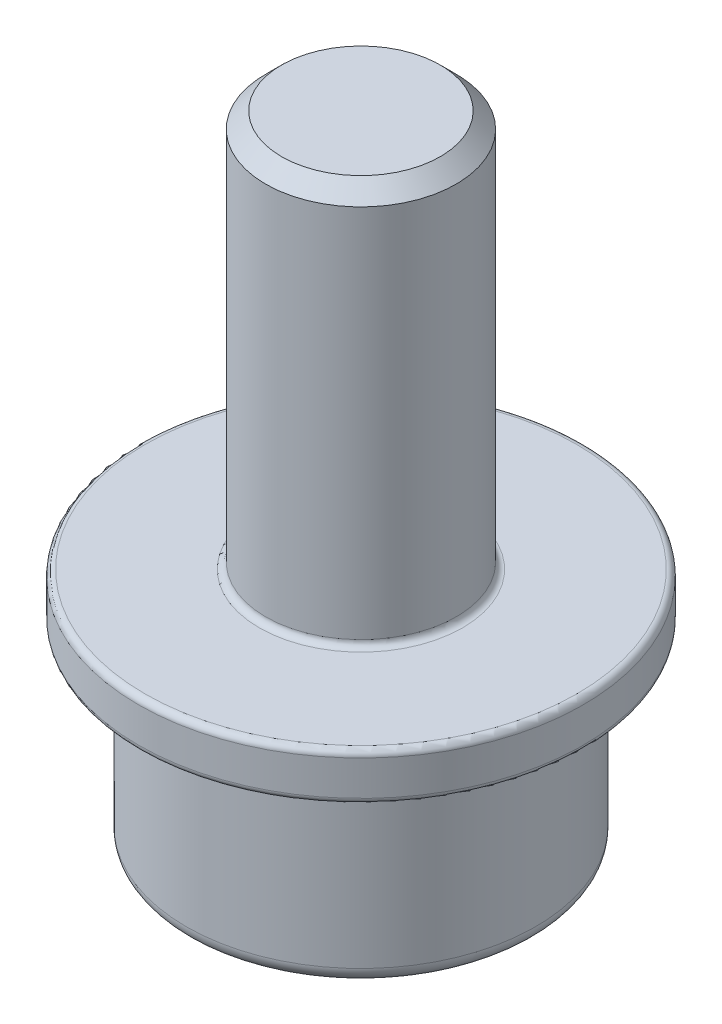
ISO-10303-21;
HEADER;
FILE_DESCRIPTION(('STEP AP214'),'2;1');
FILE_NAME('part.step','',(''),(''),'','','');
FILE_SCHEMA(('AUTOMOTIVE_DESIGN { 1 0 10303 214 1 1 1 1 }'));
ENDSEC;
DATA;
#1=APPLICATION_CONTEXT('core data for automotive mechanical design processes');
#2=APPLICATION_PROTOCOL_DEFINITION('international standard','automotive_design',2000,#1);
#3=PRODUCT_CONTEXT('',#1,'mechanical');
#4=PRODUCT('Part','Part','',(#3));
#5=PRODUCT_RELATED_PRODUCT_CATEGORY('part','',(#4));
#6=PRODUCT_DEFINITION_FORMATION('','',#4);
#7=PRODUCT_DEFINITION_CONTEXT('part definition',#1,'design');
#8=PRODUCT_DEFINITION('design','',#6,#7);
#9=PRODUCT_DEFINITION_SHAPE('','',#8);
#10=(LENGTH_UNIT() NAMED_UNIT(*) SI_UNIT(.MILLI.,.METRE.));
#11=(NAMED_UNIT(*) PLANE_ANGLE_UNIT() SI_UNIT($,.RADIAN.));
#12=(NAMED_UNIT(*) SI_UNIT($,.STERADIAN.) SOLID_ANGLE_UNIT());
#13=UNCERTAINTY_MEASURE_WITH_UNIT(LENGTH_MEASURE(1.E-05),#10,'distance_accuracy_value','');
#14=(GEOMETRIC_REPRESENTATION_CONTEXT(3) GLOBAL_UNCERTAINTY_ASSIGNED_CONTEXT((#13)) GLOBAL_UNIT_ASSIGNED_CONTEXT((#10,
#11,#12)) REPRESENTATION_CONTEXT('',''));
#15=CARTESIAN_POINT('',(0.,0.,0.));
#16=DIRECTION('',(0.,0.,1.));
#17=DIRECTION('',(1.,0.,0.));
#18=AXIS2_PLACEMENT_3D('',#15,#16,#17);
#19=CARTESIAN_POINT('',(0.,3.,0.));
#20=DIRECTION('',(0.,-1.,0.));
#21=DIRECTION('',(0.,0.,-1.));
#22=AXIS2_PLACEMENT_3D('',#19,#20,#21);
#23=CYLINDRICAL_SURFACE('',#22,2.75);
#24=CARTESIAN_POINT('',(0.,2.9,0.));
#25=DIRECTION('',(0.,1.,0.));
#26=DIRECTION('',(0.,0.,1.));
#27=AXIS2_PLACEMENT_3D('',#24,#25,#26);
#28=CIRCLE('',#27,2.75);
#29=CARTESIAN_POINT('',(0.,2.9,2.75));
#30=VERTEX_POINT('',#29);
#31=EDGE_CURVE('E201',#30,#30,#28,.F.);
#32=ORIENTED_EDGE('',*,*,#31,.T.);
#33=EDGE_LOOP('',(#32));
#34=FACE_BOUND('',#33,.T.);
#35=CARTESIAN_POINT('',(0.,0.25,0.));
#36=DIRECTION('',(0.,1.,0.));
#37=DIRECTION('',(0.,0.,1.));
#38=AXIS2_PLACEMENT_3D('',#35,#36,#37);
#39=CIRCLE('',#38,2.75);
#40=CARTESIAN_POINT('',(0.,0.25,2.75));
#41=VERTEX_POINT('',#40);
#42=EDGE_CURVE('E174',#41,#41,#39,.T.);
#43=ORIENTED_EDGE('',*,*,#42,.T.);
#44=EDGE_LOOP('',(#43));
#45=FACE_BOUND('',#44,.T.);
#46=ADVANCED_FACE('F33',(#34,#45),#23,.T.);
#47=CARTESIAN_POINT('',(0.,0.,0.));
#48=DIRECTION('',(0.,1.,0.));
#49=DIRECTION('',(0.,0.,1.));
#50=AXIS2_PLACEMENT_3D('',#47,#48,#49);
#51=PLANE('',#50);
#52=CARTESIAN_POINT('',(0.,0.,0.));
#53=DIRECTION('',(0.,1.,0.));
#54=DIRECTION('',(0.,0.,1.));
#55=AXIS2_PLACEMENT_3D('',#52,#53,#54);
#56=CIRCLE('',#55,2.5);
#57=CARTESIAN_POINT('',(0.,0.,2.5));
#58=VERTEX_POINT('',#57);
#59=EDGE_CURVE('E189',#58,#58,#56,.F.);
#60=ORIENTED_EDGE('',*,*,#59,.T.);
#61=EDGE_LOOP('',(#60));
#62=FACE_BOUND('',#61,.T.);
#63=DIRECTION('',(-0.69197693122312,0.,-0.721919612321922));
#64=VECTOR('',#63,1.);
#65=CARTESIAN_POINT('',(1.02450088015783,0.,-0.982008194523007));
#66=LINE('',#65,#64);
#67=CARTESIAN_POINT('',(1.59146357561211,0.,-0.390512335578876));
#68=VERTEX_POINT('',#67);
#69=CARTESIAN_POINT('',(0.457538184703553,0.,-1.57350405346714));
#70=VERTEX_POINT('',#69);
#71=EDGE_CURVE('E153',#68,#70,#66,.T.);
#72=ORIENTED_EDGE('',*,*,#71,.T.);
#73=DIRECTION('',(-0.971189189372558,0.,0.238309795111058));
#74=VECTOR('',#73,1.);
#75=CARTESIAN_POINT('',(-0.3381936031025,0.,-1.3782478856777));
#76=LINE('',#75,#74);
#77=CARTESIAN_POINT('',(-1.13392539090855,0.,-1.18299171788826));
#78=VERTEX_POINT('',#77);
#79=EDGE_CURVE('E163',#70,#78,#76,.T.);
#80=ORIENTED_EDGE('',*,*,#79,.T.);
#81=DIRECTION('',(-0.279212258149438,0.,0.96022940743298));
#82=VECTOR('',#81,1.);
#83=CARTESIAN_POINT('',(-1.36269448326033,0.,-0.396239691154693));
#84=LINE('',#83,#82);
#85=CARTESIAN_POINT('',(-1.5914635756121,0.,0.390512335578876));
#86=VERTEX_POINT('',#85);
#87=EDGE_CURVE('E161',#78,#86,#84,.T.);
#88=ORIENTED_EDGE('',*,*,#87,.T.);
#89=DIRECTION('',(0.69197693122312,0.,0.721919612321922));
#90=VECTOR('',#89,1.);
#91=CARTESIAN_POINT('',(-1.02450088015783,0.,0.982008194523007));
#92=LINE('',#91,#90);
#93=CARTESIAN_POINT('',(-0.457538184703552,0.,1.57350405346714));
#94=VERTEX_POINT('',#93);
#95=EDGE_CURVE('E159',#86,#94,#92,.T.);
#96=ORIENTED_EDGE('',*,*,#95,.T.);
#97=DIRECTION('',(0.971189189372558,0.,-0.238309795111058));
#98=VECTOR('',#97,1.);
#99=CARTESIAN_POINT('',(0.3381936031025,0.,1.3782478856777));
#100=LINE('',#99,#98);
#101=CARTESIAN_POINT('',(1.13392539090855,0.,1.18299171788826));
#102=VERTEX_POINT('',#101);
#103=EDGE_CURVE('E157',#94,#102,#100,.T.);
#104=ORIENTED_EDGE('',*,*,#103,.T.);
#105=DIRECTION('',(0.279212258149438,0.,-0.96022940743298));
#106=VECTOR('',#105,1.);
#107=CARTESIAN_POINT('',(1.36269448326033,0.,0.396239691154693));
#108=LINE('',#107,#106);
#109=EDGE_CURVE('E155',#102,#68,#108,.T.);
#110=ORIENTED_EDGE('',*,*,#109,.T.);
#111=EDGE_LOOP('',(#72,#80,#88,#96,#104,#110));
#112=FACE_BOUND('',#111,.T.);
#113=ADVANCED_FACE('F243',(#62,#112),#51,.F.);
#114=CARTESIAN_POINT('',(1.31110540565295,1.5,-0.321718223399928));
#115=DIRECTION('',(0.96022940743298,0.,0.279212258149438));
#116=DIRECTION('',(0.279212258149438,0.,-0.96022940743298));
#117=AXIS2_PLACEMENT_3D('',#114,#115,#116);
#118=PLANE('',#117);
#119=DIRECTION('',(0.,-1.,0.));
#120=VECTOR('',#119,1.);
#121=CARTESIAN_POINT('',(1.31110540565295,1.5,-0.321718223399928));
#122=LINE('',#121,#120);
#123=CARTESIAN_POINT('',(1.31110540565295,1.5,-0.321718223399928));
#124=VERTEX_POINT('',#123);
#125=CARTESIAN_POINT('',(1.31110540565295,0.250000000000002,-0.321718223399928));
#126=VERTEX_POINT('',#125);
#127=EDGE_CURVE('E139',#124,#126,#122,.T.);
#128=ORIENTED_EDGE('',*,*,#127,.T.);
#129=DIRECTION('',(-0.279212258149438,0.,0.96022940743298));
#130=VECTOR('',#129,1.);
#131=CARTESIAN_POINT('',(1.31110540565295,0.250000000000002,-0.321718223399928));
#132=LINE('',#131,#130);
#133=CARTESIAN_POINT('',(0.934168857151212,0.250000000000002,0.974591476634595));
#134=VERTEX_POINT('',#133);
#135=EDGE_CURVE('E55',#126,#134,#132,.T.);
#136=ORIENTED_EDGE('',*,*,#135,.T.);
#137=DIRECTION('',(0.,-1.,0.));
#138=VECTOR('',#137,1.);
#139=CARTESIAN_POINT('',(0.934168857151212,1.5,0.974591476634595));
#140=LINE('',#139,#138);
#141=CARTESIAN_POINT('',(0.934168857151212,1.5,0.974591476634595));
#142=VERTEX_POINT('',#141);
#143=EDGE_CURVE('E103',#142,#134,#140,.T.);
#144=ORIENTED_EDGE('',*,*,#143,.F.);
#145=DIRECTION('',(-0.279212258149438,0.,0.96022940743298));
#146=VECTOR('',#145,1.);
#147=CARTESIAN_POINT('',(1.31110540565295,1.5,-0.321718223399928));
#148=LINE('',#147,#146);
#149=EDGE_CURVE('E107',#124,#142,#148,.T.);
#150=ORIENTED_EDGE('',*,*,#149,.F.);
#151=EDGE_LOOP('',(#128,#136,#144,#150));
#152=FACE_BOUND('',#151,.T.);
#153=ADVANCED_FACE('F105',(#152),#118,.F.);
#154=CARTESIAN_POINT('',(0.376936548501741,1.5,-1.29630970003452));
#155=DIRECTION('',(0.721919612321922,0.,-0.69197693122312));
#156=DIRECTION('',(-0.69197693122312,0.,-0.721919612321922));
#157=AXIS2_PLACEMENT_3D('',#154,#155,#156);
#158=PLANE('',#157);
#159=DIRECTION('',(0.,-1.,0.));
#160=VECTOR('',#159,1.);
#161=CARTESIAN_POINT('',(0.376936548501741,1.5,-1.29630970003452));
#162=LINE('',#161,#160);
#163=CARTESIAN_POINT('',(0.376936548501741,1.5,-1.29630970003452));
#164=VERTEX_POINT('',#163);
#165=CARTESIAN_POINT('',(0.376936548501741,0.250000000000002,-1.29630970003452));
#166=VERTEX_POINT('',#165);
#167=EDGE_CURVE('E142',#164,#166,#162,.T.);
#168=ORIENTED_EDGE('',*,*,#167,.T.);
#169=DIRECTION('',(0.69197693122312,0.,0.721919612321922));
#170=VECTOR('',#169,1.);
#171=CARTESIAN_POINT('',(0.376936548501741,0.250000000000002,-1.29630970003452));
#172=LINE('',#171,#170);
#173=EDGE_CURVE('E48',#166,#126,#172,.T.);
#174=ORIENTED_EDGE('',*,*,#173,.T.);
#175=ORIENTED_EDGE('',*,*,#127,.F.);
#176=DIRECTION('',(0.69197693122312,0.,0.721919612321922));
#177=VECTOR('',#176,1.);
#178=CARTESIAN_POINT('',(0.376936548501741,1.5,-1.29630970003452));
#179=LINE('',#178,#177);
#180=EDGE_CURVE('E112',#164,#124,#179,.T.);
#181=ORIENTED_EDGE('',*,*,#180,.F.);
#182=EDGE_LOOP('',(#168,#174,#175,#181));
#183=FACE_BOUND('',#182,.T.);
#184=ADVANCED_FACE('F310',(#183),#158,.F.);
#185=CARTESIAN_POINT('',(-0.934168857151211,1.5,-0.974591476634595));
#186=DIRECTION('',(-0.238309795111058,0.,-0.971189189372557));
#187=DIRECTION('',(-0.971189189372558,0.,0.238309795111058));
#188=AXIS2_PLACEMENT_3D('',#185,#186,#187);
#189=PLANE('',#188);
#190=DIRECTION('',(0.,-1.,0.));
#191=VECTOR('',#190,1.);
#192=CARTESIAN_POINT('',(-0.934168857151211,1.5,-0.974591476634595));
#193=LINE('',#192,#191);
#194=CARTESIAN_POINT('',(-0.934168857151211,1.5,-0.974591476634595));
#195=VERTEX_POINT('',#194);
#196=CARTESIAN_POINT('',(-0.934168857151211,0.250000000000002,-0.974591476634595));
#197=VERTEX_POINT('',#196);
#198=EDGE_CURVE('E144',#195,#197,#193,.T.);
#199=ORIENTED_EDGE('',*,*,#198,.T.);
#200=DIRECTION('',(0.971189189372558,0.,-0.238309795111058));
#201=VECTOR('',#200,1.);
#202=CARTESIAN_POINT('',(-0.934168857151211,0.250000000000002,-0.974591476634595));
#203=LINE('',#202,#201);
#204=EDGE_CURVE('E141',#197,#166,#203,.T.);
#205=ORIENTED_EDGE('',*,*,#204,.T.);
#206=ORIENTED_EDGE('',*,*,#167,.F.);
#207=DIRECTION('',(0.971189189372558,0.,-0.238309795111058));
#208=VECTOR('',#207,1.);
#209=CARTESIAN_POINT('',(-0.934168857151211,1.5,-0.974591476634595));
#210=LINE('',#209,#208);
#211=EDGE_CURVE('E136',#195,#164,#210,.T.);
#212=ORIENTED_EDGE('',*,*,#211,.F.);
#213=EDGE_LOOP('',(#199,#205,#206,#212));
#214=FACE_BOUND('',#213,.T.);
#215=ADVANCED_FACE('F320',(#214),#189,.F.);
#216=CARTESIAN_POINT('',(-1.31110540565295,1.5,0.321718223399928));
#217=DIRECTION('',(-0.96022940743298,0.,-0.279212258149438));
#218=DIRECTION('',(-0.279212258149438,0.,0.96022940743298));
#219=AXIS2_PLACEMENT_3D('',#216,#217,#218);
#220=PLANE('',#219);
#221=DIRECTION('',(0.,-1.,0.));
#222=VECTOR('',#221,1.);
#223=CARTESIAN_POINT('',(-1.31110540565295,1.5,0.321718223399928));
#224=LINE('',#223,#222);
#225=CARTESIAN_POINT('',(-1.31110540565295,1.5,0.321718223399928));
#226=VERTEX_POINT('',#225);
#227=CARTESIAN_POINT('',(-1.31110540565295,0.250000000000002,0.321718223399928));
#228=VERTEX_POINT('',#227);
#229=EDGE_CURVE('E147',#226,#228,#224,.T.);
#230=ORIENTED_EDGE('',*,*,#229,.T.);
#231=DIRECTION('',(0.279212258149438,0.,-0.96022940743298));
#232=VECTOR('',#231,1.);
#233=CARTESIAN_POINT('',(-1.31110540565295,0.250000000000002,0.321718223399928));
#234=LINE('',#233,#232);
#235=EDGE_CURVE('E166',#228,#197,#234,.T.);
#236=ORIENTED_EDGE('',*,*,#235,.T.);
#237=ORIENTED_EDGE('',*,*,#198,.F.);
#238=DIRECTION('',(0.279212258149438,0.,-0.96022940743298));
#239=VECTOR('',#238,1.);
#240=CARTESIAN_POINT('',(-1.31110540565295,1.5,0.321718223399928));
#241=LINE('',#240,#239);
#242=EDGE_CURVE('E133',#226,#195,#241,.T.);
#243=ORIENTED_EDGE('',*,*,#242,.F.);
#244=EDGE_LOOP('',(#230,#236,#237,#243));
#245=FACE_BOUND('',#244,.T.);
#246=ADVANCED_FACE('F316',(#245),#220,.F.);
#247=CARTESIAN_POINT('',(-0.376936548501741,1.5,1.29630970003452));
#248=DIRECTION('',(-0.721919612321922,0.,0.69197693122312));
#249=DIRECTION('',(0.69197693122312,0.,0.721919612321922));
#250=AXIS2_PLACEMENT_3D('',#247,#248,#249);
#251=PLANE('',#250);
#252=DIRECTION('',(0.,-1.,0.));
#253=VECTOR('',#252,1.);
#254=CARTESIAN_POINT('',(-0.376936548501741,1.5,1.29630970003452));
#255=LINE('',#254,#253);
#256=CARTESIAN_POINT('',(-0.376936548501741,1.5,1.29630970003452));
#257=VERTEX_POINT('',#256);
#258=CARTESIAN_POINT('',(-0.376936548501741,0.250000000000002,1.29630970003452));
#259=VERTEX_POINT('',#258);
#260=EDGE_CURVE('E111',#257,#259,#255,.T.);
#261=ORIENTED_EDGE('',*,*,#260,.T.);
#262=DIRECTION('',(-0.69197693122312,0.,-0.721919612321922));
#263=VECTOR('',#262,1.);
#264=CARTESIAN_POINT('',(-0.376936548501741,0.250000000000002,1.29630970003452));
#265=LINE('',#264,#263);
#266=EDGE_CURVE('E168',#259,#228,#265,.T.);
#267=ORIENTED_EDGE('',*,*,#266,.T.);
#268=ORIENTED_EDGE('',*,*,#229,.F.);
#269=DIRECTION('',(-0.69197693122312,0.,-0.721919612321922));
#270=VECTOR('',#269,1.);
#271=CARTESIAN_POINT('',(-0.376936548501741,1.5,1.29630970003452));
#272=LINE('',#271,#270);
#273=EDGE_CURVE('E121',#257,#226,#272,.T.);
#274=ORIENTED_EDGE('',*,*,#273,.F.);
#275=EDGE_LOOP('',(#261,#267,#268,#274));
#276=FACE_BOUND('',#275,.T.);
#277=ADVANCED_FACE('F313',(#276),#251,.F.);
#278=CARTESIAN_POINT('',(0.934168857151212,1.5,0.974591476634595));
#279=DIRECTION('',(0.238309795111058,0.,0.971189189372558));
#280=DIRECTION('',(0.971189189372558,0.,-0.238309795111058));
#281=AXIS2_PLACEMENT_3D('',#278,#279,#280);
#282=PLANE('',#281);
#283=ORIENTED_EDGE('',*,*,#143,.T.);
#284=DIRECTION('',(-0.971189189372558,0.,0.238309795111058));
#285=VECTOR('',#284,1.);
#286=CARTESIAN_POINT('',(0.934168857151212,0.250000000000002,0.974591476634595));
#287=LINE('',#286,#285);
#288=EDGE_CURVE('E170',#134,#259,#287,.T.);
#289=ORIENTED_EDGE('',*,*,#288,.T.);
#290=ORIENTED_EDGE('',*,*,#260,.F.);
#291=DIRECTION('',(-0.971189189372557,0.,0.238309795111058));
#292=VECTOR('',#291,1.);
#293=CARTESIAN_POINT('',(0.934168857151212,1.5,0.974591476634595));
#294=LINE('',#293,#292);
#295=EDGE_CURVE('E115',#142,#257,#294,.T.);
#296=ORIENTED_EDGE('',*,*,#295,.F.);
#297=EDGE_LOOP('',(#283,#289,#290,#296));
#298=FACE_BOUND('',#297,.T.);
#299=ADVANCED_FACE('F116',(#298),#282,.F.);
#300=CARTESIAN_POINT('',(0.,1.5,0.));
#301=DIRECTION('',(0.,-1.,0.));
#302=DIRECTION('',(0.,0.,-1.));
#303=AXIS2_PLACEMENT_3D('',#300,#301,#302);
#304=PLANE('',#303);
#305=ORIENTED_EDGE('',*,*,#149,.T.);
#306=ORIENTED_EDGE('',*,*,#295,.T.);
#307=ORIENTED_EDGE('',*,*,#273,.T.);
#308=ORIENTED_EDGE('',*,*,#242,.T.);
#309=ORIENTED_EDGE('',*,*,#211,.T.);
#310=ORIENTED_EDGE('',*,*,#180,.T.);
#311=EDGE_LOOP('',(#305,#306,#307,#308,#309,#310));
#312=FACE_BOUND('',#311,.T.);
#313=ADVANCED_FACE('F123',(#312),#304,.T.);
#314=CARTESIAN_POINT('',(0.934168857151212,0.250000000000002,0.974591476634595));
#315=DIRECTION('',(0.168510472146206,0.707106781186547,0.686734461620402));
#316=DIRECTION('',(-0.971189189372558,0.,0.238309795111058));
#317=AXIS2_PLACEMENT_3D('',#314,#315,#316);
#318=PLANE('',#317);
#319=DIRECTION('',(-0.523085392288577,0.654653670707978,-0.545719931652561));
#320=VECTOR('',#319,1.);
#321=CARTESIAN_POINT('',(0.934168857151212,0.250000000000002,0.974591476634595));
#322=LINE('',#321,#320);
#323=EDGE_CURVE('E129',#102,#134,#322,.T.);
#324=ORIENTED_EDGE('',*,*,#323,.F.);
#325=ORIENTED_EDGE('',*,*,#103,.F.);
#326=DIRECTION('',(0.211064628018337,0.654653670707978,-0.725865203896737));
#327=VECTOR('',#326,1.);
#328=CARTESIAN_POINT('',(-0.376936548501741,0.250000000000002,1.29630970003452));
#329=LINE('',#328,#327);
#330=EDGE_CURVE('E126',#259,#94,#329,.F.);
#331=ORIENTED_EDGE('',*,*,#330,.F.);
#332=ORIENTED_EDGE('',*,*,#288,.F.);
#333=EDGE_LOOP('',(#324,#325,#331,#332));
#334=FACE_BOUND('',#333,.T.);
#335=ADVANCED_FACE('F273',(#334),#318,.F.);
#336=CARTESIAN_POINT('',(-0.376936548501741,0.250000000000002,1.29630970003452));
#337=DIRECTION('',(-0.510474253344395,0.707106781186547,0.489301580492525));
#338=DIRECTION('',(-0.69197693122312,0.,-0.721919612321922));
#339=AXIS2_PLACEMENT_3D('',#336,#337,#338);
#340=PLANE('',#339);
#341=ORIENTED_EDGE('',*,*,#330,.T.);
#342=ORIENTED_EDGE('',*,*,#95,.F.);
#343=DIRECTION('',(0.734150020306914,0.654653670707978,-0.180145272244176));
#344=VECTOR('',#343,1.);
#345=CARTESIAN_POINT('',(-1.31110540565295,0.250000000000002,0.321718223399928));
#346=LINE('',#345,#344);
#347=EDGE_CURVE('E182',#228,#86,#346,.F.);
#348=ORIENTED_EDGE('',*,*,#347,.F.);
#349=ORIENTED_EDGE('',*,*,#266,.F.);
#350=EDGE_LOOP('',(#341,#342,#348,#349));
#351=FACE_BOUND('',#350,.T.);
#352=ADVANCED_FACE('F269',(#351),#340,.F.);
#353=CARTESIAN_POINT('',(1.31110540565295,0.250000000000002,-0.321718223399928));
#354=DIRECTION('',(0.678984725490601,0.707106781186547,0.197432881127877));
#355=DIRECTION('',(-0.279212258149438,0.,0.96022940743298));
#356=AXIS2_PLACEMENT_3D('',#353,#354,#355);
#357=PLANE('',#356);
#358=ORIENTED_EDGE('',*,*,#323,.T.);
#359=ORIENTED_EDGE('',*,*,#135,.F.);
#360=DIRECTION('',(-0.734150020306914,0.654653670707978,0.180145272244176));
#361=VECTOR('',#360,1.);
#362=CARTESIAN_POINT('',(1.31110540565295,0.250000000000002,-0.321718223399928));
#363=LINE('',#362,#361);
#364=EDGE_CURVE('E179',#68,#126,#363,.T.);
#365=ORIENTED_EDGE('',*,*,#364,.F.);
#366=ORIENTED_EDGE('',*,*,#109,.F.);
#367=EDGE_LOOP('',(#358,#359,#365,#366));
#368=FACE_BOUND('',#367,.T.);
#369=ADVANCED_FACE('F265',(#368),#357,.F.);
#370=CARTESIAN_POINT('',(-1.31110540565295,0.250000000000002,0.321718223399928));
#371=DIRECTION('',(-0.678984725490601,0.707106781186547,-0.197432881127877));
#372=DIRECTION('',(0.279212258149438,0.,-0.96022940743298));
#373=AXIS2_PLACEMENT_3D('',#370,#371,#372);
#374=PLANE('',#373);
#375=ORIENTED_EDGE('',*,*,#347,.T.);
#376=ORIENTED_EDGE('',*,*,#87,.F.);
#377=DIRECTION('',(0.523085392288577,0.654653670707978,0.545719931652561));
#378=VECTOR('',#377,1.);
#379=CARTESIAN_POINT('',(-0.934168857151211,0.250000000000002,-0.974591476634595));
#380=LINE('',#379,#378);
#381=EDGE_CURVE('E177',#197,#78,#380,.F.);
#382=ORIENTED_EDGE('',*,*,#381,.F.);
#383=ORIENTED_EDGE('',*,*,#235,.F.);
#384=EDGE_LOOP('',(#375,#376,#382,#383));
#385=FACE_BOUND('',#384,.T.);
#386=ADVANCED_FACE('F261',(#385),#374,.F.);
#387=CARTESIAN_POINT('',(0.376936548501741,0.250000000000002,-1.29630970003452));
#388=DIRECTION('',(0.510474253344395,0.707106781186547,-0.489301580492525));
#389=DIRECTION('',(0.69197693122312,0.,0.721919612321922));
#390=AXIS2_PLACEMENT_3D('',#387,#388,#389);
#391=PLANE('',#390);
#392=ORIENTED_EDGE('',*,*,#364,.T.);
#393=ORIENTED_EDGE('',*,*,#173,.F.);
#394=DIRECTION('',(0.211064628018338,-0.654653670707978,-0.725865203896737));
#395=VECTOR('',#394,1.);
#396=CARTESIAN_POINT('',(0.269240391786958,0.584038370031143,-0.92593550002466));
#397=LINE('',#396,#395);
#398=EDGE_CURVE('E175',#70,#166,#397,.F.);
#399=ORIENTED_EDGE('',*,*,#398,.F.);
#400=ORIENTED_EDGE('',*,*,#71,.F.);
#401=EDGE_LOOP('',(#392,#393,#399,#400));
#402=FACE_BOUND('',#401,.T.);
#403=ADVANCED_FACE('F257',(#402),#391,.F.);
#404=CARTESIAN_POINT('',(-0.934168857151211,0.250000000000002,-0.974591476634595));
#405=DIRECTION('',(-0.168510472146206,0.707106781186547,-0.686734461620402));
#406=DIRECTION('',(0.971189189372558,0.,-0.238309795111058));
#407=AXIS2_PLACEMENT_3D('',#404,#405,#406);
#408=PLANE('',#407);
#409=ORIENTED_EDGE('',*,*,#381,.T.);
#410=ORIENTED_EDGE('',*,*,#79,.F.);
#411=ORIENTED_EDGE('',*,*,#398,.T.);
#412=ORIENTED_EDGE('',*,*,#204,.F.);
#413=EDGE_LOOP('',(#409,#410,#411,#412));
#414=FACE_BOUND('',#413,.T.);
#415=ADVANCED_FACE('F254',(#414),#408,.F.);
#416=CARTESIAN_POINT('',(0.,0.25,0.));
#417=DIRECTION('',(0.,1.,0.));
#418=DIRECTION('',(0.,0.,1.));
#419=AXIS2_PLACEMENT_3D('',#416,#417,#418);
#420=TOROIDAL_SURFACE('',#419,2.5,0.25);
#421=ORIENTED_EDGE('',*,*,#59,.F.);
#422=EDGE_LOOP('',(#421));
#423=FACE_BOUND('',#422,.T.);
#424=ORIENTED_EDGE('',*,*,#42,.F.);
#425=EDGE_LOOP('',(#424));
#426=FACE_BOUND('',#425,.T.);
#427=ADVANCED_FACE('F239',(#423,#426),#420,.T.);
#428=CARTESIAN_POINT('',(0.,2.9,0.));
#429=DIRECTION('',(0.,1.,0.));
#430=DIRECTION('',(0.,0.,1.));
#431=AXIS2_PLACEMENT_3D('',#428,#429,#430);
#432=TOROIDAL_SURFACE('',#431,2.65,0.1);
#433=ORIENTED_EDGE('',*,*,#31,.F.);
#434=EDGE_LOOP('',(#433));
#435=FACE_BOUND('',#434,.T.);
#436=CARTESIAN_POINT('',(0.,3.,0.));
#437=DIRECTION('',(0.,1.,0.));
#438=DIRECTION('',(0.,0.,1.));
#439=AXIS2_PLACEMENT_3D('',#436,#437,#438);
#440=CIRCLE('',#439,2.65);
#441=CARTESIAN_POINT('',(0.,3.,2.65));
#442=VERTEX_POINT('',#441);
#443=EDGE_CURVE('E198',#442,#442,#440,.T.);
#444=ORIENTED_EDGE('',*,*,#443,.F.);
#445=EDGE_LOOP('',(#444));
#446=FACE_BOUND('',#445,.T.);
#447=ADVANCED_FACE('F230',(#435,#446),#432,.T.);
#448=CARTESIAN_POINT('',(0.,3.75,0.));
#449=DIRECTION('',(0.,1.,0.));
#450=DIRECTION('',(0.,0.,1.));
#451=AXIS2_PLACEMENT_3D('',#448,#449,#450);
#452=PLANE('',#451);
#453=CARTESIAN_POINT('',(0.,3.75,0.));
#454=DIRECTION('',(0.,1.,0.));
#455=DIRECTION('',(0.,0.,1.));
#456=AXIS2_PLACEMENT_3D('',#453,#454,#455);
#457=CIRCLE('',#456,1.6);
#458=CARTESIAN_POINT('',(0.,3.75,1.6));
#459=VERTEX_POINT('',#458);
#460=EDGE_CURVE('E210',#459,#459,#457,.F.);
#461=ORIENTED_EDGE('',*,*,#460,.T.);
#462=EDGE_LOOP('',(#461));
#463=FACE_BOUND('',#462,.T.);
#464=CARTESIAN_POINT('',(0.,3.75,0.));
#465=DIRECTION('',(0.,1.,0.));
#466=DIRECTION('',(0.,0.,1.));
#467=AXIS2_PLACEMENT_3D('',#464,#465,#466);
#468=CIRCLE('',#467,3.4);
#469=CARTESIAN_POINT('',(0.,3.75,3.4));
#470=VERTEX_POINT('',#469);
#471=EDGE_CURVE('E207',#470,#470,#468,.T.);
#472=ORIENTED_EDGE('',*,*,#471,.T.);
#473=EDGE_LOOP('',(#472));
#474=FACE_BOUND('',#473,.T.);
#475=ADVANCED_FACE('F227',(#463,#474),#452,.T.);
#476=CARTESIAN_POINT('',(0.,3.,0.));
#477=DIRECTION('',(0.,1.,0.));
#478=DIRECTION('',(0.,0.,1.));
#479=AXIS2_PLACEMENT_3D('',#476,#477,#478);
#480=PLANE('',#479);
#481=CARTESIAN_POINT('',(0.,3.,0.));
#482=DIRECTION('',(0.,1.,0.));
#483=DIRECTION('',(0.,0.,1.));
#484=AXIS2_PLACEMENT_3D('',#481,#482,#483);
#485=CIRCLE('',#484,3.4);
#486=CARTESIAN_POINT('',(0.,3.,3.4));
#487=VERTEX_POINT('',#486);
#488=EDGE_CURVE('E11',#487,#487,#485,.F.);
#489=ORIENTED_EDGE('',*,*,#488,.T.);
#490=EDGE_LOOP('',(#489));
#491=FACE_BOUND('',#490,.T.);
#492=ORIENTED_EDGE('',*,*,#443,.T.);
#493=EDGE_LOOP('',(#492));
#494=FACE_BOUND('',#493,.T.);
#495=ADVANCED_FACE('F229',(#491,#494),#480,.F.);
#496=CARTESIAN_POINT('',(0.,3.75,0.));
#497=DIRECTION('',(0.,-1.,0.));
#498=DIRECTION('',(0.,0.,-1.));
#499=AXIS2_PLACEMENT_3D('',#496,#497,#498);
#500=CYLINDRICAL_SURFACE('',#499,3.5);
#501=CARTESIAN_POINT('',(0.,3.65,0.));
#502=DIRECTION('',(0.,1.,0.));
#503=DIRECTION('',(0.,0.,1.));
#504=AXIS2_PLACEMENT_3D('',#501,#502,#503);
#505=CIRCLE('',#504,3.5);
#506=CARTESIAN_POINT('',(0.,3.65,3.5));
#507=VERTEX_POINT('',#506);
#508=EDGE_CURVE('E41',#507,#507,#505,.F.);
#509=ORIENTED_EDGE('',*,*,#508,.T.);
#510=EDGE_LOOP('',(#509));
#511=FACE_BOUND('',#510,.T.);
#512=CARTESIAN_POINT('',(0.,3.1,0.));
#513=DIRECTION('',(0.,1.,0.));
#514=DIRECTION('',(0.,0.,1.));
#515=AXIS2_PLACEMENT_3D('',#512,#513,#514);
#516=CIRCLE('',#515,3.5);
#517=CARTESIAN_POINT('',(0.,3.1,3.5));
#518=VERTEX_POINT('',#517);
#519=EDGE_CURVE('E213',#518,#518,#516,.T.);
#520=ORIENTED_EDGE('',*,*,#519,.T.);
#521=EDGE_LOOP('',(#520));
#522=FACE_BOUND('',#521,.T.);
#523=ADVANCED_FACE('F218',(#511,#522),#500,.T.);
#524=CARTESIAN_POINT('',(0.,10.,0.));
#525=DIRECTION('',(0.,1.,0.));
#526=DIRECTION('',(0.,0.,1.));
#527=AXIS2_PLACEMENT_3D('',#524,#525,#526);
#528=PLANE('',#527);
#529=CARTESIAN_POINT('',(0.,10.,0.));
#530=DIRECTION('',(0.,1.,0.));
#531=DIRECTION('',(0.,0.,1.));
#532=AXIS2_PLACEMENT_3D('',#529,#530,#531);
#533=CIRCLE('',#532,1.25);
#534=CARTESIAN_POINT('',(0.,10.,1.25));
#535=VERTEX_POINT('',#534);
#536=EDGE_CURVE('E192',#535,#535,#533,.T.);
#537=ORIENTED_EDGE('',*,*,#536,.T.);
#538=EDGE_LOOP('',(#537));
#539=FACE_BOUND('',#538,.T.);
#540=ADVANCED_FACE('F284',(#539),#528,.T.);
#541=CARTESIAN_POINT('',(0.,10.,0.));
#542=DIRECTION('',(0.,-1.,0.));
#543=DIRECTION('',(0.,0.,-1.));
#544=AXIS2_PLACEMENT_3D('',#541,#542,#543);
#545=CONICAL_SURFACE('',#544,1.25,0.785398163397446);
#546=CARTESIAN_POINT('',(0.,9.75,0.));
#547=DIRECTION('',(0.,1.,0.));
#548=DIRECTION('',(0.,0.,1.));
#549=AXIS2_PLACEMENT_3D('',#546,#547,#548);
#550=CIRCLE('',#549,1.5);
#551=CARTESIAN_POINT('',(0.,9.75,1.5));
#552=VERTEX_POINT('',#551);
#553=EDGE_CURVE('E195',#552,#552,#550,.F.);
#554=ORIENTED_EDGE('',*,*,#553,.F.);
#555=EDGE_LOOP('',(#554));
#556=FACE_BOUND('',#555,.T.);
#557=ORIENTED_EDGE('',*,*,#536,.F.);
#558=EDGE_LOOP('',(#557));
#559=FACE_BOUND('',#558,.T.);
#560=ADVANCED_FACE('F281',(#556,#559),#545,.T.);
#561=CARTESIAN_POINT('',(0.,10.,0.));
#562=DIRECTION('',(0.,-1.,0.));
#563=DIRECTION('',(0.,0.,-1.));
#564=AXIS2_PLACEMENT_3D('',#561,#562,#563);
#565=CYLINDRICAL_SURFACE('',#564,1.5);
#566=CARTESIAN_POINT('',(0.,3.85,0.));
#567=DIRECTION('',(0.,1.,0.));
#568=DIRECTION('',(0.,0.,1.));
#569=AXIS2_PLACEMENT_3D('',#566,#567,#568);
#570=CIRCLE('',#569,1.5);
#571=CARTESIAN_POINT('',(0.,3.85,1.5));
#572=VERTEX_POINT('',#571);
#573=EDGE_CURVE('E204',#572,#572,#570,.T.);
#574=ORIENTED_EDGE('',*,*,#573,.T.);
#575=EDGE_LOOP('',(#574));
#576=FACE_BOUND('',#575,.T.);
#577=ORIENTED_EDGE('',*,*,#553,.T.);
#578=EDGE_LOOP('',(#577));
#579=FACE_BOUND('',#578,.T.);
#580=ADVANCED_FACE('F283',(#576,#579),#565,.T.);
#581=CARTESIAN_POINT('',(0.,3.85,0.));
#582=DIRECTION('',(0.,1.,0.));
#583=DIRECTION('',(0.,0.,1.));
#584=AXIS2_PLACEMENT_3D('',#581,#582,#583);
#585=TOROIDAL_SURFACE('',#584,1.6,0.1);
#586=ORIENTED_EDGE('',*,*,#460,.F.);
#587=EDGE_LOOP('',(#586));
#588=FACE_BOUND('',#587,.T.);
#589=ORIENTED_EDGE('',*,*,#573,.F.);
#590=EDGE_LOOP('',(#589));
#591=FACE_BOUND('',#590,.T.);
#592=ADVANCED_FACE('F224',(#588,#591),#585,.F.);
#593=CARTESIAN_POINT('',(0.,3.65,0.));
#594=DIRECTION('',(0.,1.,0.));
#595=DIRECTION('',(0.,0.,1.));
#596=AXIS2_PLACEMENT_3D('',#593,#594,#595);
#597=TOROIDAL_SURFACE('',#596,3.4,0.1);
#598=ORIENTED_EDGE('',*,*,#508,.F.);
#599=EDGE_LOOP('',(#598));
#600=FACE_BOUND('',#599,.T.);
#601=ORIENTED_EDGE('',*,*,#471,.F.);
#602=EDGE_LOOP('',(#601));
#603=FACE_BOUND('',#602,.T.);
#604=ADVANCED_FACE('F221',(#600,#603),#597,.T.);
#605=CARTESIAN_POINT('',(0.,3.1,0.));
#606=DIRECTION('',(0.,1.,0.));
#607=DIRECTION('',(0.,0.,1.));
#608=AXIS2_PLACEMENT_3D('',#605,#606,#607);
#609=TOROIDAL_SURFACE('',#608,3.4,0.1);
#610=ORIENTED_EDGE('',*,*,#488,.F.);
#611=EDGE_LOOP('',(#610));
#612=FACE_BOUND('',#611,.T.);
#613=ORIENTED_EDGE('',*,*,#519,.F.);
#614=EDGE_LOOP('',(#613));
#615=FACE_BOUND('',#614,.T.);
#616=ADVANCED_FACE('F35',(#612,#615),#609,.T.);
#617=CLOSED_SHELL('',(#46,#113,#153,#184,#215,#246,#277,#299,#313,#335,#352,#369,#386,#403,#415,
#427,#447,#475,#495,#523,#540,#560,#580,#592,#604,#616));
#618=MANIFOLD_SOLID_BREP('B2',#617);
#619=ADVANCED_BREP_SHAPE_REPRESENTATION('',(#18,#618),#14);
#620=SHAPE_DEFINITION_REPRESENTATION(#9,#619);
ENDSEC;
END-ISO-10303-21;
